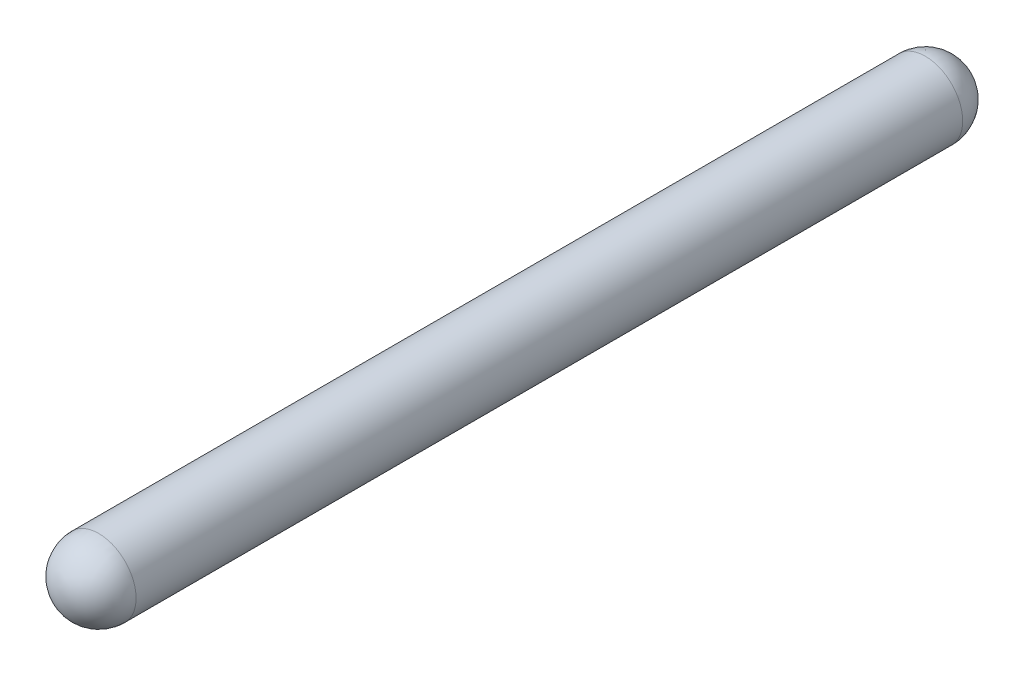
ISO-10303-21;
HEADER;
FILE_DESCRIPTION(('STEP AP214'),'2;1');
FILE_NAME('part.step','',(''),(''),'','','');
FILE_SCHEMA(('AUTOMOTIVE_DESIGN { 1 0 10303 214 1 1 1 1 }'));
ENDSEC;
DATA;
#1=APPLICATION_CONTEXT('core data for automotive mechanical design processes');
#2=APPLICATION_PROTOCOL_DEFINITION('international standard','automotive_design',2000,#1);
#3=PRODUCT_CONTEXT('',#1,'mechanical');
#4=PRODUCT('Part','Part','',(#3));
#5=PRODUCT_RELATED_PRODUCT_CATEGORY('part','',(#4));
#6=PRODUCT_DEFINITION_FORMATION('','',#4);
#7=PRODUCT_DEFINITION_CONTEXT('part definition',#1,'design');
#8=PRODUCT_DEFINITION('design','',#6,#7);
#9=PRODUCT_DEFINITION_SHAPE('','',#8);
#10=(LENGTH_UNIT() NAMED_UNIT(*) SI_UNIT(.MILLI.,.METRE.));
#11=(NAMED_UNIT(*) PLANE_ANGLE_UNIT() SI_UNIT($,.RADIAN.));
#12=(NAMED_UNIT(*) SI_UNIT($,.STERADIAN.) SOLID_ANGLE_UNIT());
#13=UNCERTAINTY_MEASURE_WITH_UNIT(LENGTH_MEASURE(1.E-05),#10,'distance_accuracy_value','');
#14=(GEOMETRIC_REPRESENTATION_CONTEXT(3) GLOBAL_UNCERTAINTY_ASSIGNED_CONTEXT((#13)) GLOBAL_UNIT_ASSIGNED_CONTEXT((#10,
#11,#12)) REPRESENTATION_CONTEXT('',''));
#15=CARTESIAN_POINT('',(0.,0.,0.));
#16=DIRECTION('',(0.,0.,1.));
#17=DIRECTION('',(1.,0.,0.));
#18=AXIS2_PLACEMENT_3D('',#15,#16,#17);
#19=CARTESIAN_POINT('',(-3.2004,4.7244,-3.));
#20=DIRECTION('',(1.,0.,0.));
#21=DIRECTION('',(0.,-1.,0.));
#22=AXIS2_PLACEMENT_3D('',#19,#20,#21);
#23=SPHERICAL_SURFACE('',#22,0.4072);
#24=CARTESIAN_POINT('',(-3.2004,4.7244,-3.));
#25=DIRECTION('',(0.,0.,1.));
#26=DIRECTION('',(1.,0.,0.));
#27=AXIS2_PLACEMENT_3D('',#24,#25,#26);
#28=CIRCLE('',#27,0.4072);
#29=CARTESIAN_POINT('',(-2.7932,4.7244,-3.));
#30=VERTEX_POINT('',#29);
#31=CARTESIAN_POINT('',(-3.6076,4.7244,-3.));
#32=VERTEX_POINT('',#31);
#33=EDGE_CURVE('E42',#30,#32,#28,.T.);
#34=ORIENTED_EDGE('',*,*,#33,.F.);
#35=CARTESIAN_POINT('',(-3.2004,4.7244,-3.));
#36=DIRECTION('',(0.,0.,1.));
#37=DIRECTION('',(1.,0.,0.));
#38=AXIS2_PLACEMENT_3D('',#35,#36,#37);
#39=CIRCLE('',#38,0.4072);
#40=EDGE_CURVE('E26',#32,#30,#39,.T.);
#41=ORIENTED_EDGE('',*,*,#40,.F.);
#42=EDGE_LOOP('',(#34,#41));
#43=FACE_BOUND('',#42,.T.);
#44=ADVANCED_FACE('F17',(#43),#23,.T.);
#45=CARTESIAN_POINT('',(-3.2004,4.7244,6.));
#46=DIRECTION('',(1.,0.,0.));
#47=DIRECTION('',(0.,1.,0.));
#48=AXIS2_PLACEMENT_3D('',#45,#46,#47);
#49=SPHERICAL_SURFACE('',#48,0.4072);
#50=CARTESIAN_POINT('',(-3.2004,4.7244,6.));
#51=DIRECTION('',(0.,0.,1.));
#52=DIRECTION('',(1.,0.,0.));
#53=AXIS2_PLACEMENT_3D('',#50,#51,#52);
#54=CIRCLE('',#53,0.4072);
#55=CARTESIAN_POINT('',(-2.7932,4.7244,6.));
#56=VERTEX_POINT('',#55);
#57=CARTESIAN_POINT('',(-3.6076,4.7244,6.));
#58=VERTEX_POINT('',#57);
#59=EDGE_CURVE('E11',#56,#58,#54,.F.);
#60=ORIENTED_EDGE('',*,*,#59,.F.);
#61=CARTESIAN_POINT('',(-3.2004,4.7244,6.));
#62=DIRECTION('',(0.,0.,1.));
#63=DIRECTION('',(1.,0.,0.));
#64=AXIS2_PLACEMENT_3D('',#61,#62,#63);
#65=CIRCLE('',#64,0.4072);
#66=EDGE_CURVE('E34',#58,#56,#65,.F.);
#67=ORIENTED_EDGE('',*,*,#66,.F.);
#68=EDGE_LOOP('',(#60,#67));
#69=FACE_BOUND('',#68,.T.);
#70=ADVANCED_FACE('F49',(#69),#49,.T.);
#71=CARTESIAN_POINT('',(-3.2004,4.7244,-3.));
#72=DIRECTION('',(0.,0.,1.));
#73=DIRECTION('',(1.,0.,0.));
#74=AXIS2_PLACEMENT_3D('',#71,#72,#73);
#75=CYLINDRICAL_SURFACE('',#74,0.4072);
#76=ORIENTED_EDGE('',*,*,#66,.T.);
#77=ORIENTED_EDGE('',*,*,#59,.T.);
#78=EDGE_LOOP('',(#76,#77));
#79=FACE_BOUND('',#78,.T.);
#80=ORIENTED_EDGE('',*,*,#40,.T.);
#81=ORIENTED_EDGE('',*,*,#33,.T.);
#82=EDGE_LOOP('',(#80,#81));
#83=FACE_BOUND('',#82,.T.);
#84=ADVANCED_FACE('F45',(#79,#83),#75,.T.);
#85=CLOSED_SHELL('',(#44,#70,#84));
#86=MANIFOLD_SOLID_BREP('B1',#85);
#87=ADVANCED_BREP_SHAPE_REPRESENTATION('',(#18,#86),#14);
#88=SHAPE_DEFINITION_REPRESENTATION(#9,#87);
ENDSEC;
END-ISO-10303-21;
